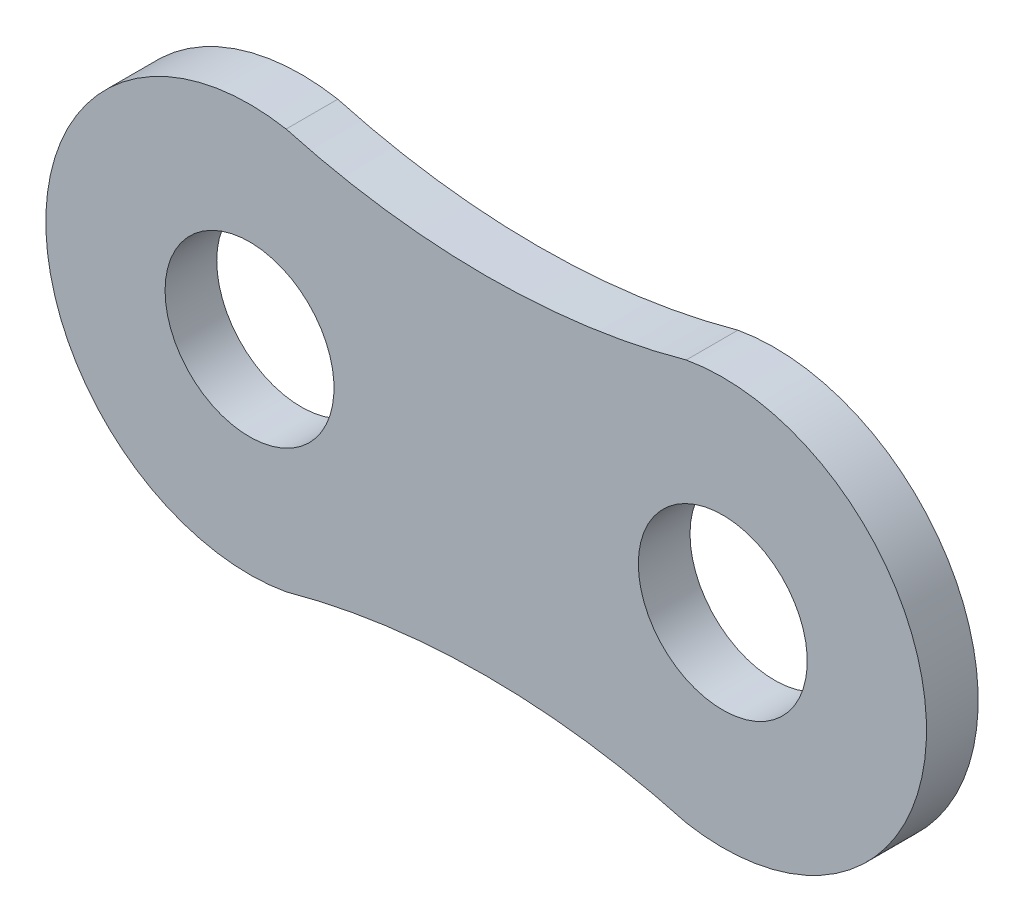
ISO-10303-21;
HEADER;
FILE_DESCRIPTION(('STEP AP214'),'2;1');
FILE_NAME('part.step','',(''),(''),'','','');
FILE_SCHEMA(('AUTOMOTIVE_DESIGN { 1 0 10303 214 1 1 1 1 }'));
ENDSEC;
DATA;
#1=APPLICATION_CONTEXT('core data for automotive mechanical design processes');
#2=APPLICATION_PROTOCOL_DEFINITION('international standard','automotive_design',2000,#1);
#3=PRODUCT_CONTEXT('',#1,'mechanical');
#4=PRODUCT('Part','Part','',(#3));
#5=PRODUCT_RELATED_PRODUCT_CATEGORY('part','',(#4));
#6=PRODUCT_DEFINITION_FORMATION('','',#4);
#7=PRODUCT_DEFINITION_CONTEXT('part definition',#1,'design');
#8=PRODUCT_DEFINITION('design','',#6,#7);
#9=PRODUCT_DEFINITION_SHAPE('','',#8);
#10=(LENGTH_UNIT() NAMED_UNIT(*) SI_UNIT(.MILLI.,.METRE.));
#11=(NAMED_UNIT(*) PLANE_ANGLE_UNIT() SI_UNIT($,.RADIAN.));
#12=(NAMED_UNIT(*) SI_UNIT($,.STERADIAN.) SOLID_ANGLE_UNIT());
#13=UNCERTAINTY_MEASURE_WITH_UNIT(LENGTH_MEASURE(1.E-05),#10,'distance_accuracy_value','');
#14=(GEOMETRIC_REPRESENTATION_CONTEXT(3) GLOBAL_UNCERTAINTY_ASSIGNED_CONTEXT((#13)) GLOBAL_UNIT_ASSIGNED_CONTEXT((#10,
#11,#12)) REPRESENTATION_CONTEXT('',''));
#15=CARTESIAN_POINT('',(0.,0.,0.));
#16=DIRECTION('',(0.,0.,1.));
#17=DIRECTION('',(1.,0.,0.));
#18=AXIS2_PLACEMENT_3D('',#15,#16,#17);
#19=CARTESIAN_POINT('',(13.550961325029,-4.033300234333,-5.19000000000008));
#20=DIRECTION('',(0.,0.,0.999999999999998));
#21=DIRECTION('',(-1.,0.,0.));
#22=AXIS2_PLACEMENT_3D('',#19,#20,#21);
#23=PLANE('',#22);
#24=CARTESIAN_POINT('',(4.76250000000006,0.,-5.19000000000003));
#25=DIRECTION('',(0.,0.,-0.999999999999998));
#26=DIRECTION('',(-1.,0.,0.));
#27=AXIS2_PLACEMENT_3D('',#24,#25,#26);
#28=CIRCLE('',#27,1.7);
#29=CARTESIAN_POINT('',(3.06250000000003,0.,-5.19000000000003));
#30=VERTEX_POINT('',#29);
#31=EDGE_CURVE('E116',#30,#30,#28,.T.);
#32=ORIENTED_EDGE('',*,*,#31,.F.);
#33=EDGE_LOOP('',(#32));
#34=FACE_BOUND('',#33,.T.);
#35=CARTESIAN_POINT('',(14.2875000000001,0.,-5.18999999999986));
#36=DIRECTION('',(0.,0.,-0.999999999999998));
#37=DIRECTION('',(-1.,0.,0.));
#38=AXIS2_PLACEMENT_3D('',#35,#36,#37);
#39=CIRCLE('',#38,1.7);
#40=CARTESIAN_POINT('',(12.5875000000001,0.,-5.18999999999986));
#41=VERTEX_POINT('',#40);
#42=EDGE_CURVE('E99',#41,#41,#39,.T.);
#43=ORIENTED_EDGE('',*,*,#42,.F.);
#44=EDGE_LOOP('',(#43));
#45=FACE_BOUND('',#44,.T.);
#46=CARTESIAN_POINT('',(9.52500000000006,18.547765210198,-5.18999999999986));
#47=DIRECTION('',(0.,0.,-0.999999999999998));
#48=DIRECTION('',(-1.,0.,0.));
#49=AXIS2_PLACEMENT_3D('',#46,#47,#48);
#50=CIRCLE('',#49,15.062471846485);
#51=CARTESIAN_POINT('',(13.5509613250076,4.03330023432924,-5.18999999999969));
#52=VERTEX_POINT('',#51);
#53=CARTESIAN_POINT('',(5.49903867499241,4.03330023433016,-5.18999999999986));
#54=VERTEX_POINT('',#53);
#55=EDGE_CURVE('E91',#52,#54,#50,.T.);
#56=ORIENTED_EDGE('',*,*,#55,.F.);
#57=CARTESIAN_POINT('',(14.2875000000001,0.,-5.18999999999986));
#58=DIRECTION('',(0.,0.,-0.999999999999998));
#59=DIRECTION('',(-1.,0.,0.));
#60=AXIS2_PLACEMENT_3D('',#57,#58,#59);
#61=CIRCLE('',#60,4.1);
#62=CARTESIAN_POINT('',(13.5509613250541,-4.03330023433773,-5.19000000000008));
#63=VERTEX_POINT('',#62);
#64=EDGE_CURVE('E93',#52,#63,#61,.T.);
#65=ORIENTED_EDGE('',*,*,#64,.T.);
#66=CARTESIAN_POINT('',(9.52500000000009,-18.5477652101901,-5.18999999999997));
#67=DIRECTION('',(0.,0.,-0.999999999999998));
#68=DIRECTION('',(-1.,0.,0.));
#69=AXIS2_PLACEMENT_3D('',#66,#67,#68);
#70=CIRCLE('',#69,15.062471846485);
#71=CARTESIAN_POINT('',(5.49903867495008,-4.03330023433701,-5.19000000000003));
#72=VERTEX_POINT('',#71);
#73=EDGE_CURVE('E38',#72,#63,#70,.T.);
#74=ORIENTED_EDGE('',*,*,#73,.F.);
#75=CARTESIAN_POINT('',(4.76250000000006,0.,-5.19000000000003));
#76=DIRECTION('',(0.,0.,-0.999999999999998));
#77=DIRECTION('',(-1.,0.,0.));
#78=AXIS2_PLACEMENT_3D('',#75,#76,#77);
#79=CIRCLE('',#78,4.1);
#80=EDGE_CURVE('E82',#72,#54,#79,.T.);
#81=ORIENTED_EDGE('',*,*,#80,.T.);
#82=EDGE_LOOP('',(#56,#65,#74,#81));
#83=FACE_BOUND('',#82,.T.);
#84=ADVANCED_FACE('F35',(#34,#45,#83),#23,.F.);
#85=CARTESIAN_POINT('',(9.52500000000009,-18.5477652101901,-4.14999999999999));
#86=DIRECTION('',(0.,0.,0.999999999999998));
#87=DIRECTION('',(-1.,0.,0.));
#88=AXIS2_PLACEMENT_3D('',#85,#86,#87);
#89=CYLINDRICAL_SURFACE('',#88,15.062471846485);
#90=ORIENTED_EDGE('',*,*,#73,.T.);
#91=DIRECTION('',(0.,0.,0.999999999999998));
#92=VECTOR('',#91,1.);
#93=CARTESIAN_POINT('',(13.5509613250251,-4.03330023433246,-4.15000000000004));
#94=LINE('',#93,#92);
#95=CARTESIAN_POINT('',(13.5509613250542,-4.03330023433776,-4.15000000000004));
#96=VERTEX_POINT('',#95);
#97=EDGE_CURVE('E96',#63,#96,#94,.T.);
#98=ORIENTED_EDGE('',*,*,#97,.T.);
#99=CARTESIAN_POINT('',(9.52500000000009,-18.5477652101901,-4.14999999999999));
#100=DIRECTION('',(0.,0.,-0.999999999999998));
#101=DIRECTION('',(-1.,0.,0.));
#102=AXIS2_PLACEMENT_3D('',#99,#100,#101);
#103=CIRCLE('',#102,15.062471846485);
#104=CARTESIAN_POINT('',(5.49903867495002,-4.03330023433707,-4.14999999999999));
#105=VERTEX_POINT('',#104);
#106=EDGE_CURVE('E79',#96,#105,#103,.F.);
#107=ORIENTED_EDGE('',*,*,#106,.T.);
#108=DIRECTION('',(0.,0.,0.999999999999998));
#109=VECTOR('',#108,1.);
#110=CARTESIAN_POINT('',(5.49903867498311,-4.03330023433102,-4.14999999999999));
#111=LINE('',#110,#109);
#112=EDGE_CURVE('E73',#105,#72,#111,.F.);
#113=ORIENTED_EDGE('',*,*,#112,.T.);
#114=EDGE_LOOP('',(#90,#98,#107,#113));
#115=FACE_BOUND('',#114,.T.);
#116=ADVANCED_FACE('F75',(#115),#89,.F.);
#117=CARTESIAN_POINT('',(4.76250000000003,0.,-4.14999999999999));
#118=DIRECTION('',(0.,0.,0.999999999999998));
#119=DIRECTION('',(-1.,0.,0.));
#120=AXIS2_PLACEMENT_3D('',#117,#118,#119);
#121=CYLINDRICAL_SURFACE('',#120,4.1);
#122=ORIENTED_EDGE('',*,*,#80,.F.);
#123=ORIENTED_EDGE('',*,*,#112,.F.);
#124=CARTESIAN_POINT('',(4.76250000000003,0.,-4.14999999999999));
#125=DIRECTION('',(0.,0.,-0.999999999999998));
#126=DIRECTION('',(-1.,0.,0.));
#127=AXIS2_PLACEMENT_3D('',#124,#125,#126);
#128=CIRCLE('',#127,4.1);
#129=CARTESIAN_POINT('',(5.49903867499232,4.0333002343301,-4.14999999999982));
#130=VERTEX_POINT('',#129);
#131=EDGE_CURVE('E114',#105,#130,#128,.T.);
#132=ORIENTED_EDGE('',*,*,#131,.T.);
#133=DIRECTION('',(0.,0.,0.999999999999998));
#134=VECTOR('',#133,1.);
#135=CARTESIAN_POINT('',(5.49903867498355,4.03330023433251,-4.14999999999982));
#136=LINE('',#135,#134);
#137=EDGE_CURVE('E87',#54,#130,#136,.T.);
#138=ORIENTED_EDGE('',*,*,#137,.F.);
#139=EDGE_LOOP('',(#122,#123,#132,#138));
#140=FACE_BOUND('',#139,.T.);
#141=ADVANCED_FACE('F85',(#140),#121,.T.);
#142=CARTESIAN_POINT('',(9.52500000000003,18.547765210198,-4.14999999999982));
#143=DIRECTION('',(0.,0.,0.999999999999998));
#144=DIRECTION('',(-1.,0.,0.));
#145=AXIS2_PLACEMENT_3D('',#142,#143,#144);
#146=CYLINDRICAL_SURFACE('',#145,15.062471846485);
#147=ORIENTED_EDGE('',*,*,#55,.T.);
#148=ORIENTED_EDGE('',*,*,#137,.T.);
#149=CARTESIAN_POINT('',(9.52500000000003,18.547765210198,-4.14999999999982));
#150=DIRECTION('',(0.,0.,-0.999999999999998));
#151=DIRECTION('',(-1.,0.,0.));
#152=AXIS2_PLACEMENT_3D('',#149,#150,#151);
#153=CIRCLE('',#152,15.062471846485);
#154=CARTESIAN_POINT('',(13.5509613250076,4.03330023432924,-4.14999999999965));
#155=VERTEX_POINT('',#154);
#156=EDGE_CURVE('E112',#130,#155,#153,.F.);
#157=ORIENTED_EDGE('',*,*,#156,.T.);
#158=DIRECTION('',(0.,0.,0.999999999999998));
#159=VECTOR('',#158,1.);
#160=CARTESIAN_POINT('',(13.5509613250162,4.03330023433079,-4.14999999999965));
#161=LINE('',#160,#159);
#162=EDGE_CURVE('E97',#155,#52,#161,.F.);
#163=ORIENTED_EDGE('',*,*,#162,.T.);
#164=EDGE_LOOP('',(#147,#148,#157,#163));
#165=FACE_BOUND('',#164,.T.);
#166=ADVANCED_FACE('F134',(#165),#146,.F.);
#167=CARTESIAN_POINT('',(14.2875000000001,0.,-4.14999999999982));
#168=DIRECTION('',(0.,0.,0.999999999999998));
#169=DIRECTION('',(-1.,0.,0.));
#170=AXIS2_PLACEMENT_3D('',#167,#168,#169);
#171=CYLINDRICAL_SURFACE('',#170,4.1);
#172=ORIENTED_EDGE('',*,*,#64,.F.);
#173=ORIENTED_EDGE('',*,*,#162,.F.);
#174=CARTESIAN_POINT('',(14.2875000000001,0.,-4.14999999999982));
#175=DIRECTION('',(0.,0.,-0.999999999999998));
#176=DIRECTION('',(-1.,0.,0.));
#177=AXIS2_PLACEMENT_3D('',#174,#175,#176);
#178=CIRCLE('',#177,4.1);
#179=EDGE_CURVE('E53',#155,#96,#178,.T.);
#180=ORIENTED_EDGE('',*,*,#179,.T.);
#181=ORIENTED_EDGE('',*,*,#97,.F.);
#182=EDGE_LOOP('',(#172,#173,#180,#181));
#183=FACE_BOUND('',#182,.T.);
#184=ADVANCED_FACE('F139',(#183),#171,.T.);
#185=CARTESIAN_POINT('',(14.2875000000001,0.,-4.14999999999982));
#186=DIRECTION('',(0.,0.,0.999999999999998));
#187=DIRECTION('',(-1.,0.,0.));
#188=AXIS2_PLACEMENT_3D('',#185,#186,#187);
#189=CYLINDRICAL_SURFACE('',#188,1.7);
#190=CARTESIAN_POINT('',(14.2875000000001,0.,-4.14999999999982));
#191=DIRECTION('',(0.,0.,-0.999999999999998));
#192=DIRECTION('',(-1.,0.,0.));
#193=AXIS2_PLACEMENT_3D('',#190,#191,#192);
#194=CIRCLE('',#193,1.7);
#195=CARTESIAN_POINT('',(12.5875000000001,0.,-4.14999999999982));
#196=VERTEX_POINT('',#195);
#197=EDGE_CURVE('E44',#196,#196,#194,.F.);
#198=CARTESIAN_POINT('',(12.5875000000001,0.,-5.18999999999986));
#199=CARTESIAN_POINT('',(12.5875000000001,0.,-5.17916666666653));
#200=CARTESIAN_POINT('',(12.5875000000001,0.,-5.16833333333319));
#201=CARTESIAN_POINT('',(12.5875000000001,0.,-5.14666666666653));
#202=CARTESIAN_POINT('',(12.5875000000001,0.,-5.13583333333319));
#203=CARTESIAN_POINT('',(12.5875000000001,0.,-5.11416666666652));
#204=CARTESIAN_POINT('',(12.5875000000001,0.,-5.10333333333319));
#205=CARTESIAN_POINT('',(12.5875000000001,0.,-5.08166666666652));
#206=CARTESIAN_POINT('',(12.5875000000001,0.,-5.07083333333319));
#207=CARTESIAN_POINT('',(12.5875000000001,0.,-5.04916666666652));
#208=CARTESIAN_POINT('',(12.5875000000001,0.,-5.03833333333319));
#209=CARTESIAN_POINT('',(12.5875000000001,0.,-5.01666666666652));
#210=CARTESIAN_POINT('',(12.5875000000001,0.,-5.00583333333319));
#211=CARTESIAN_POINT('',(12.5875000000001,0.,-4.98416666666652));
#212=CARTESIAN_POINT('',(12.5875000000001,0.,-4.97333333333319));
#213=CARTESIAN_POINT('',(12.5875000000001,0.,-4.95166666666652));
#214=CARTESIAN_POINT('',(12.5875000000001,0.,-4.94083333333318));
#215=CARTESIAN_POINT('',(12.5875000000001,0.,-4.91916666666652));
#216=CARTESIAN_POINT('',(12.5875000000001,0.,-4.90833333333318));
#217=CARTESIAN_POINT('',(12.5875000000001,0.,-4.88666666666652));
#218=CARTESIAN_POINT('',(12.5875000000001,0.,-4.87583333333318));
#219=CARTESIAN_POINT('',(12.5875000000001,0.,-4.85416666666651));
#220=CARTESIAN_POINT('',(12.5875000000001,0.,-4.84333333333318));
#221=CARTESIAN_POINT('',(12.5875000000001,0.,-4.82166666666651));
#222=CARTESIAN_POINT('',(12.5875000000001,0.,-4.81083333333318));
#223=CARTESIAN_POINT('',(12.5875000000001,0.,-4.78916666666651));
#224=CARTESIAN_POINT('',(12.5875000000001,0.,-4.77833333333318));
#225=CARTESIAN_POINT('',(12.5875000000001,0.,-4.75666666666651));
#226=CARTESIAN_POINT('',(12.5875000000001,0.,-4.74583333333318));
#227=CARTESIAN_POINT('',(12.5875000000001,0.,-4.72416666666651));
#228=CARTESIAN_POINT('',(12.5875000000001,0.,-4.71333333333318));
#229=CARTESIAN_POINT('',(12.5875000000001,0.,-4.69166666666651));
#230=CARTESIAN_POINT('',(12.5875000000001,0.,-4.68083333333317));
#231=CARTESIAN_POINT('',(12.5875000000001,0.,-4.65916666666651));
#232=CARTESIAN_POINT('',(12.5875000000001,0.,-4.64833333333317));
#233=CARTESIAN_POINT('',(12.5875000000001,0.,-4.62666666666651));
#234=CARTESIAN_POINT('',(12.5875000000001,0.,-4.61583333333317));
#235=CARTESIAN_POINT('',(12.5875000000001,0.,-4.5941666666665));
#236=CARTESIAN_POINT('',(12.5875000000001,0.,-4.58333333333317));
#237=CARTESIAN_POINT('',(12.5875000000001,0.,-4.5616666666665));
#238=CARTESIAN_POINT('',(12.5875000000001,0.,-4.55083333333317));
#239=CARTESIAN_POINT('',(12.5875000000001,0.,-4.5291666666665));
#240=CARTESIAN_POINT('',(12.5875000000001,0.,-4.51833333333317));
#241=CARTESIAN_POINT('',(12.5875000000001,0.,-4.4966666666665));
#242=CARTESIAN_POINT('',(12.5875000000001,0.,-4.48583333333317));
#243=CARTESIAN_POINT('',(12.5875000000001,0.,-4.4641666666665));
#244=CARTESIAN_POINT('',(12.5875000000001,0.,-4.45333333333317));
#245=CARTESIAN_POINT('',(12.5875000000001,0.,-4.4316666666665));
#246=CARTESIAN_POINT('',(12.5875000000001,0.,-4.42083333333316));
#247=CARTESIAN_POINT('',(12.5875000000001,0.,-4.3991666666665));
#248=CARTESIAN_POINT('',(12.5875000000001,0.,-4.38833333333316));
#249=CARTESIAN_POINT('',(12.5875000000001,0.,-4.3666666666665));
#250=CARTESIAN_POINT('',(12.5875000000001,0.,-4.35583333333316));
#251=CARTESIAN_POINT('',(12.5875000000001,0.,-4.33416666666649));
#252=CARTESIAN_POINT('',(12.5875000000001,0.,-4.32333333333316));
#253=CARTESIAN_POINT('',(12.5875000000001,0.,-4.30166666666649));
#254=CARTESIAN_POINT('',(12.5875000000001,0.,-4.29083333333316));
#255=CARTESIAN_POINT('',(12.5875000000001,0.,-4.26916666666649));
#256=CARTESIAN_POINT('',(12.5875000000001,0.,-4.25833333333316));
#257=CARTESIAN_POINT('',(12.5875000000001,0.,-4.23666666666649));
#258=CARTESIAN_POINT('',(12.5875000000001,0.,-4.22583333333316));
#259=CARTESIAN_POINT('',(12.5875000000001,0.,-4.20416666666649));
#260=CARTESIAN_POINT('',(12.5875000000001,0.,-4.19333333333315));
#261=CARTESIAN_POINT('',(12.5875000000001,0.,-4.17166666666649));
#262=CARTESIAN_POINT('',(12.5875000000001,0.,-4.16083333333315));
#263=CARTESIAN_POINT('',(12.5875000000001,0.,-4.14999999999982));
#264=B_SPLINE_CURVE_WITH_KNOTS('',3,(#198,#199,#200,#201,#202,#203,#204,#205,#206,#207,#208,
#209,#210,#211,#212,#213,#214,#215,#216,#217,#218,#219,#220,#221,#222,#223,#224,#225,#226,#227,
#228,#229,#230,#231,#232,#233,#234,#235,#236,#237,#238,#239,#240,#241,#242,#243,#244,#245,#246,
#247,#248,#249,#250,#251,#252,#253,#254,#255,#256,#257,#258,#259,#260,#261,#262,#263),
.UNSPECIFIED.,.F.,.F.,(4,2,2,2,2,2,2,2,2,2,2,2,2,2,2,2,2,2,2,2,2,2,2,2,2,2,2,2,2,2,2,2,4),(0.,
0.0325000000000004,0.0650000000000026,0.0975000000000038,0.130000000000005,0.162500000000006,
0.195000000000008,0.227500000000009,0.26000000000001,0.292500000000011,0.325000000000013,
0.357500000000014,0.390000000000015,0.422500000000016,0.455000000000018,0.487500000000019,
0.52000000000002,0.552500000000021,0.585000000000023,0.617500000000024,0.650000000000026,
0.682500000000026,0.715000000000028,0.747500000000029,0.780000000000031,0.812500000000031,
0.845000000000033,0.877500000000034,0.910000000000036,0.942500000000036,0.975000000000038,
1.00750000000004,1.04000000000004),.UNSPECIFIED.);
#265=EDGE_CURVE('BSEAM123',#41,#196,#264,.T.);
#266=ORIENTED_EDGE('',*,*,#42,.T.);
#267=ORIENTED_EDGE('',*,*,#197,.T.);
#268=ORIENTED_EDGE('',*,*,#265,.T.);
#269=ORIENTED_EDGE('',*,*,#265,.F.);
#270=EDGE_LOOP('',(#266,#268,#267,#269));
#271=FACE_BOUND('',#270,.T.);
#272=ADVANCED_FACE('F123',(#271),#189,.F.);
#273=CARTESIAN_POINT('',(4.76250000000003,0.,-4.14999999999999));
#274=DIRECTION('',(0.,0.,0.999999999999998));
#275=DIRECTION('',(-1.,0.,0.));
#276=AXIS2_PLACEMENT_3D('',#273,#274,#275);
#277=CYLINDRICAL_SURFACE('',#276,1.7);
#278=CARTESIAN_POINT('',(4.76250000000003,0.,-4.14999999999999));
#279=DIRECTION('',(0.,0.,-0.999999999999998));
#280=DIRECTION('',(-1.,0.,0.));
#281=AXIS2_PLACEMENT_3D('',#278,#279,#280);
#282=CIRCLE('',#281,1.7);
#283=CARTESIAN_POINT('',(3.06250000000003,0.,-4.14999999999999));
#284=VERTEX_POINT('',#283);
#285=EDGE_CURVE('E11',#284,#284,#282,.F.);
#286=CARTESIAN_POINT('',(3.06250000000003,0.,-5.19000000000003));
#287=CARTESIAN_POINT('',(3.06250000000003,0.,-5.17916666666669));
#288=CARTESIAN_POINT('',(3.06250000000003,0.,-5.16833333333336));
#289=CARTESIAN_POINT('',(3.06250000000003,0.,-5.14666666666669));
#290=CARTESIAN_POINT('',(3.06250000000003,0.,-5.13583333333336));
#291=CARTESIAN_POINT('',(3.06250000000003,0.,-5.11416666666669));
#292=CARTESIAN_POINT('',(3.06250000000003,0.,-5.10333333333336));
#293=CARTESIAN_POINT('',(3.06250000000003,0.,-5.08166666666669));
#294=CARTESIAN_POINT('',(3.06250000000003,0.,-5.07083333333336));
#295=CARTESIAN_POINT('',(3.06250000000003,0.,-5.04916666666669));
#296=CARTESIAN_POINT('',(3.06250000000003,0.,-5.03833333333335));
#297=CARTESIAN_POINT('',(3.06250000000003,0.,-5.01666666666669));
#298=CARTESIAN_POINT('',(3.06250000000003,0.,-5.00583333333335));
#299=CARTESIAN_POINT('',(3.06250000000003,0.,-4.98416666666669));
#300=CARTESIAN_POINT('',(3.06250000000003,0.,-4.97333333333335));
#301=CARTESIAN_POINT('',(3.06250000000003,0.,-4.95166666666668));
#302=CARTESIAN_POINT('',(3.06250000000003,0.,-4.94083333333335));
#303=CARTESIAN_POINT('',(3.06250000000003,0.,-4.91916666666668));
#304=CARTESIAN_POINT('',(3.06250000000003,0.,-4.90833333333335));
#305=CARTESIAN_POINT('',(3.06250000000003,0.,-4.88666666666668));
#306=CARTESIAN_POINT('',(3.06250000000003,0.,-4.87583333333335));
#307=CARTESIAN_POINT('',(3.06250000000003,0.,-4.85416666666668));
#308=CARTESIAN_POINT('',(3.06250000000003,0.,-4.84333333333335));
#309=CARTESIAN_POINT('',(3.06250000000003,0.,-4.82166666666668));
#310=CARTESIAN_POINT('',(3.06250000000003,0.,-4.81083333333335));
#311=CARTESIAN_POINT('',(3.06250000000003,0.,-4.78916666666668));
#312=CARTESIAN_POINT('',(3.06250000000003,0.,-4.77833333333334));
#313=CARTESIAN_POINT('',(3.06250000000003,0.,-4.75666666666668));
#314=CARTESIAN_POINT('',(3.06250000000003,0.,-4.74583333333334));
#315=CARTESIAN_POINT('',(3.06250000000003,0.,-4.72416666666668));
#316=CARTESIAN_POINT('',(3.06250000000003,0.,-4.71333333333334));
#317=CARTESIAN_POINT('',(3.06250000000003,0.,-4.69166666666667));
#318=CARTESIAN_POINT('',(3.06250000000003,0.,-4.68083333333334));
#319=CARTESIAN_POINT('',(3.06250000000003,0.,-4.65916666666667));
#320=CARTESIAN_POINT('',(3.06250000000003,0.,-4.64833333333334));
#321=CARTESIAN_POINT('',(3.06250000000003,0.,-4.62666666666667));
#322=CARTESIAN_POINT('',(3.06250000000003,0.,-4.61583333333334));
#323=CARTESIAN_POINT('',(3.06250000000003,0.,-4.59416666666667));
#324=CARTESIAN_POINT('',(3.06250000000003,0.,-4.58333333333334));
#325=CARTESIAN_POINT('',(3.06250000000003,0.,-4.56166666666667));
#326=CARTESIAN_POINT('',(3.06250000000003,0.,-4.55083333333334));
#327=CARTESIAN_POINT('',(3.06250000000003,0.,-4.52916666666667));
#328=CARTESIAN_POINT('',(3.06250000000003,0.,-4.51833333333333));
#329=CARTESIAN_POINT('',(3.06250000000003,0.,-4.49666666666667));
#330=CARTESIAN_POINT('',(3.06250000000003,0.,-4.48583333333333));
#331=CARTESIAN_POINT('',(3.06250000000003,0.,-4.46416666666666));
#332=CARTESIAN_POINT('',(3.06250000000003,0.,-4.45333333333333));
#333=CARTESIAN_POINT('',(3.06250000000003,0.,-4.43166666666666));
#334=CARTESIAN_POINT('',(3.06250000000003,0.,-4.42083333333333));
#335=CARTESIAN_POINT('',(3.06250000000003,0.,-4.39916666666666));
#336=CARTESIAN_POINT('',(3.06250000000003,0.,-4.38833333333333));
#337=CARTESIAN_POINT('',(3.06250000000003,0.,-4.36666666666666));
#338=CARTESIAN_POINT('',(3.06250000000003,0.,-4.35583333333333));
#339=CARTESIAN_POINT('',(3.06250000000003,0.,-4.33416666666666));
#340=CARTESIAN_POINT('',(3.06250000000003,0.,-4.32333333333333));
#341=CARTESIAN_POINT('',(3.06250000000003,0.,-4.30166666666666));
#342=CARTESIAN_POINT('',(3.06250000000003,0.,-4.29083333333333));
#343=CARTESIAN_POINT('',(3.06250000000003,0.,-4.26916666666666));
#344=CARTESIAN_POINT('',(3.06250000000003,0.,-4.25833333333332));
#345=CARTESIAN_POINT('',(3.06250000000003,0.,-4.23666666666666));
#346=CARTESIAN_POINT('',(3.06250000000003,0.,-4.22583333333332));
#347=CARTESIAN_POINT('',(3.06250000000003,0.,-4.20416666666666));
#348=CARTESIAN_POINT('',(3.06250000000003,0.,-4.19333333333332));
#349=CARTESIAN_POINT('',(3.06250000000003,0.,-4.17166666666665));
#350=CARTESIAN_POINT('',(3.06250000000003,0.,-4.16083333333332));
#351=CARTESIAN_POINT('',(3.06250000000003,0.,-4.14999999999999));
#352=B_SPLINE_CURVE_WITH_KNOTS('',3,(#286,#287,#288,#289,#290,#291,#292,#293,#294,#295,#296,
#297,#298,#299,#300,#301,#302,#303,#304,#305,#306,#307,#308,#309,#310,#311,#312,#313,#314,#315,
#316,#317,#318,#319,#320,#321,#322,#323,#324,#325,#326,#327,#328,#329,#330,#331,#332,#333,#334,
#335,#336,#337,#338,#339,#340,#341,#342,#343,#344,#345,#346,#347,#348,#349,#350,#351),
.UNSPECIFIED.,.F.,.F.,(4,2,2,2,2,2,2,2,2,2,2,2,2,2,2,2,2,2,2,2,2,2,2,2,2,2,2,2,2,2,2,2,4),(0.,
0.0325000000000004,0.0650000000000026,0.0975000000000038,0.130000000000005,0.162500000000006,
0.195000000000008,0.227500000000009,0.26000000000001,0.292500000000011,0.325000000000013,
0.357500000000014,0.390000000000015,0.422500000000016,0.455000000000018,0.487500000000019,
0.52000000000002,0.552500000000021,0.585000000000023,0.617500000000024,0.650000000000026,
0.682500000000026,0.715000000000028,0.747500000000029,0.780000000000031,0.812500000000031,
0.845000000000033,0.877500000000034,0.910000000000036,0.942500000000036,0.975000000000038,
1.00750000000004,1.04000000000004),.UNSPECIFIED.);
#353=EDGE_CURVE('BSEAM144',#30,#284,#352,.T.);
#354=ORIENTED_EDGE('',*,*,#31,.T.);
#355=ORIENTED_EDGE('',*,*,#285,.T.);
#356=ORIENTED_EDGE('',*,*,#353,.T.);
#357=ORIENTED_EDGE('',*,*,#353,.F.);
#358=EDGE_LOOP('',(#354,#356,#355,#357));
#359=FACE_BOUND('',#358,.T.);
#360=ADVANCED_FACE('F144',(#359),#277,.F.);
#361=CARTESIAN_POINT('',(13.5509613250291,-4.0333002343331,-4.15000000000004));
#362=DIRECTION('',(0.,0.,0.999999999999998));
#363=DIRECTION('',(-1.,0.,0.));
#364=AXIS2_PLACEMENT_3D('',#361,#362,#363);
#365=PLANE('',#364);
#366=ORIENTED_EDGE('',*,*,#285,.F.);
#367=EDGE_LOOP('',(#366));
#368=FACE_BOUND('',#367,.T.);
#369=ORIENTED_EDGE('',*,*,#197,.F.);
#370=EDGE_LOOP('',(#369));
#371=FACE_BOUND('',#370,.T.);
#372=ORIENTED_EDGE('',*,*,#156,.F.);
#373=ORIENTED_EDGE('',*,*,#131,.F.);
#374=ORIENTED_EDGE('',*,*,#106,.F.);
#375=ORIENTED_EDGE('',*,*,#179,.F.);
#376=EDGE_LOOP('',(#372,#373,#374,#375));
#377=FACE_BOUND('',#376,.T.);
#378=ADVANCED_FACE('F147',(#368,#371,#377),#365,.T.);
#379=CLOSED_SHELL('',(#84,#116,#141,#166,#184,#272,#360,#378));
#380=MANIFOLD_SOLID_BREP('B2',#379);
#381=ADVANCED_BREP_SHAPE_REPRESENTATION('',(#18,#380),#14);
#382=SHAPE_DEFINITION_REPRESENTATION(#9,#381);
ENDSEC;
END-ISO-10303-21;
